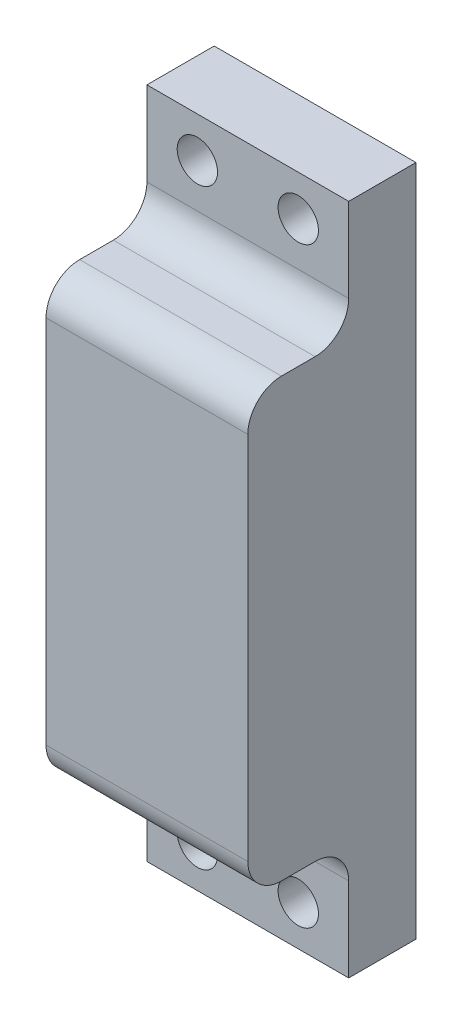
ISO-10303-21;
HEADER;
FILE_DESCRIPTION(('STEP AP214'),'2;1');
FILE_NAME('part.step','',(''),(''),'','','');
FILE_SCHEMA(('AUTOMOTIVE_DESIGN { 1 0 10303 214 1 1 1 1 }'));
ENDSEC;
DATA;
#1=APPLICATION_CONTEXT('core data for automotive mechanical design processes');
#2=APPLICATION_PROTOCOL_DEFINITION('international standard','automotive_design',2000,#1);
#3=PRODUCT_CONTEXT('',#1,'mechanical');
#4=PRODUCT('Part','Part','',(#3));
#5=PRODUCT_RELATED_PRODUCT_CATEGORY('part','',(#4));
#6=PRODUCT_DEFINITION_FORMATION('','',#4);
#7=PRODUCT_DEFINITION_CONTEXT('part definition',#1,'design');
#8=PRODUCT_DEFINITION('design','',#6,#7);
#9=PRODUCT_DEFINITION_SHAPE('','',#8);
#10=(LENGTH_UNIT() NAMED_UNIT(*) SI_UNIT(.MILLI.,.METRE.));
#11=(NAMED_UNIT(*) PLANE_ANGLE_UNIT() SI_UNIT($,.RADIAN.));
#12=(NAMED_UNIT(*) SI_UNIT($,.STERADIAN.) SOLID_ANGLE_UNIT());
#13=UNCERTAINTY_MEASURE_WITH_UNIT(LENGTH_MEASURE(1.E-05),#10,'distance_accuracy_value','');
#14=(GEOMETRIC_REPRESENTATION_CONTEXT(3) GLOBAL_UNCERTAINTY_ASSIGNED_CONTEXT((#13)) GLOBAL_UNIT_ASSIGNED_CONTEXT((#10,
#11,#12)) REPRESENTATION_CONTEXT('',''));
#15=CARTESIAN_POINT('',(0.,0.,0.));
#16=DIRECTION('',(0.,0.,1.));
#17=DIRECTION('',(1.,0.,0.));
#18=AXIS2_PLACEMENT_3D('',#15,#16,#17);
#19=CARTESIAN_POINT('',(-60.,-100.,20.));
#20=DIRECTION('',(0.,-1.,0.));
#21=DIRECTION('',(0.,0.,-1.));
#22=AXIS2_PLACEMENT_3D('',#19,#20,#21);
#23=PLANE('',#22);
#24=DIRECTION('',(0.,0.,-1.));
#25=VECTOR('',#24,1.);
#26=CARTESIAN_POINT('',(0.,-100.,20.));
#27=LINE('',#26,#25);
#28=CARTESIAN_POINT('',(0.,-100.,20.));
#29=VERTEX_POINT('',#28);
#30=CARTESIAN_POINT('',(0.,-100.,0.));
#31=VERTEX_POINT('',#30);
#32=EDGE_CURVE('E172',#29,#31,#27,.T.);
#33=ORIENTED_EDGE('',*,*,#32,.F.);
#34=DIRECTION('',(1.,0.,0.));
#35=VECTOR('',#34,1.);
#36=CARTESIAN_POINT('',(-60.,-100.,20.));
#37=LINE('',#36,#35);
#38=CARTESIAN_POINT('',(-60.,-100.,20.));
#39=VERTEX_POINT('',#38);
#40=EDGE_CURVE('E11',#39,#29,#37,.T.);
#41=ORIENTED_EDGE('',*,*,#40,.F.);
#42=DIRECTION('',(0.,0.,-1.));
#43=VECTOR('',#42,1.);
#44=CARTESIAN_POINT('',(-60.,-100.,20.));
#45=LINE('',#44,#43);
#46=CARTESIAN_POINT('',(-60.,-100.,0.));
#47=VERTEX_POINT('',#46);
#48=EDGE_CURVE('E217',#39,#47,#45,.T.);
#49=ORIENTED_EDGE('',*,*,#48,.T.);
#50=DIRECTION('',(1.,0.,0.));
#51=VECTOR('',#50,1.);
#52=CARTESIAN_POINT('',(-60.,-100.,0.));
#53=LINE('',#52,#51);
#54=EDGE_CURVE('E48',#47,#31,#53,.T.);
#55=ORIENTED_EDGE('',*,*,#54,.T.);
#56=EDGE_LOOP('',(#33,#41,#49,#55));
#57=FACE_BOUND('',#56,.T.);
#58=ADVANCED_FACE('F45',(#57),#23,.T.);
#59=CARTESIAN_POINT('',(-60.,-75.,20.));
#60=DIRECTION('',(0.,0.,1.));
#61=DIRECTION('',(1.,0.,0.));
#62=AXIS2_PLACEMENT_3D('',#59,#60,#61);
#63=PLANE('',#62);
#64=CARTESIAN_POINT('',(-15.,-88.,20.));
#65=DIRECTION('',(0.,0.,1.));
#66=DIRECTION('',(1.,0.,0.));
#67=AXIS2_PLACEMENT_3D('',#64,#65,#66);
#68=CIRCLE('',#67,6.);
#69=CARTESIAN_POINT('',(-9.,-88.,20.));
#70=VERTEX_POINT('',#69);
#71=EDGE_CURVE('E405',#70,#70,#68,.T.);
#72=ORIENTED_EDGE('',*,*,#71,.F.);
#73=EDGE_LOOP('',(#72));
#74=FACE_BOUND('',#73,.T.);
#75=CARTESIAN_POINT('',(-45.,-88.,20.));
#76=DIRECTION('',(0.,0.,1.));
#77=DIRECTION('',(1.,0.,0.));
#78=AXIS2_PLACEMENT_3D('',#75,#76,#77);
#79=CIRCLE('',#78,6.);
#80=CARTESIAN_POINT('',(-39.,-88.,20.));
#81=VERTEX_POINT('',#80);
#82=EDGE_CURVE('E391',#81,#81,#79,.T.);
#83=ORIENTED_EDGE('',*,*,#82,.F.);
#84=EDGE_LOOP('',(#83));
#85=FACE_BOUND('',#84,.T.);
#86=DIRECTION('',(0.,-1.,0.));
#87=VECTOR('',#86,1.);
#88=CARTESIAN_POINT('',(0.,-75.,20.));
#89=LINE('',#88,#87);
#90=CARTESIAN_POINT('',(0.,-75.,20.));
#91=VERTEX_POINT('',#90);
#92=EDGE_CURVE('E214',#91,#29,#89,.T.);
#93=ORIENTED_EDGE('',*,*,#92,.F.);
#94=DIRECTION('',(1.,0.,0.));
#95=VECTOR('',#94,1.);
#96=CARTESIAN_POINT('',(-60.,-75.,20.));
#97=LINE('',#96,#95);
#98=CARTESIAN_POINT('',(-60.,-75.,20.));
#99=VERTEX_POINT('',#98);
#100=EDGE_CURVE('E55',#99,#91,#97,.T.);
#101=ORIENTED_EDGE('',*,*,#100,.F.);
#102=DIRECTION('',(0.,-1.,0.));
#103=VECTOR('',#102,1.);
#104=CARTESIAN_POINT('',(-60.,-75.,20.));
#105=LINE('',#104,#103);
#106=EDGE_CURVE('E158',#99,#39,#105,.T.);
#107=ORIENTED_EDGE('',*,*,#106,.T.);
#108=ORIENTED_EDGE('',*,*,#40,.T.);
#109=EDGE_LOOP('',(#93,#101,#107,#108));
#110=FACE_BOUND('',#109,.T.);
#111=ADVANCED_FACE('F247',(#74,#85,#110),#63,.T.);
#112=CARTESIAN_POINT('',(-60.,-75.,30.));
#113=DIRECTION('',(1.,0.,0.));
#114=DIRECTION('',(0.,0.,-1.));
#115=AXIS2_PLACEMENT_3D('',#112,#113,#114);
#116=CYLINDRICAL_SURFACE('',#115,9.99999999999999);
#117=CARTESIAN_POINT('',(0.,-75.,30.));
#118=DIRECTION('',(-1.,0.,0.));
#119=DIRECTION('',(0.,0.,1.));
#120=AXIS2_PLACEMENT_3D('',#117,#118,#119);
#121=CIRCLE('',#120,9.99999999999999);
#122=CARTESIAN_POINT('',(0.,-65.,30.));
#123=VERTEX_POINT('',#122);
#124=EDGE_CURVE('E144',#123,#91,#121,.T.);
#125=ORIENTED_EDGE('',*,*,#124,.F.);
#126=DIRECTION('',(1.,0.,0.));
#127=VECTOR('',#126,1.);
#128=CARTESIAN_POINT('',(-60.,-65.,30.));
#129=LINE('',#128,#127);
#130=CARTESIAN_POINT('',(-60.,-65.,30.));
#131=VERTEX_POINT('',#130);
#132=EDGE_CURVE('E139',#131,#123,#129,.T.);
#133=ORIENTED_EDGE('',*,*,#132,.F.);
#134=CARTESIAN_POINT('',(-60.,-75.,30.));
#135=DIRECTION('',(-1.,0.,0.));
#136=DIRECTION('',(0.,0.,1.));
#137=AXIS2_PLACEMENT_3D('',#134,#135,#136);
#138=CIRCLE('',#137,9.99999999999999);
#139=EDGE_CURVE('E142',#131,#99,#138,.T.);
#140=ORIENTED_EDGE('',*,*,#139,.T.);
#141=ORIENTED_EDGE('',*,*,#100,.T.);
#142=EDGE_LOOP('',(#125,#133,#140,#141));
#143=FACE_BOUND('',#142,.T.);
#144=ADVANCED_FACE('F141',(#143),#116,.F.);
#145=CARTESIAN_POINT('',(-60.,-65.,39.9999999999999));
#146=DIRECTION('',(0.,-1.,0.));
#147=DIRECTION('',(0.,0.,-1.));
#148=AXIS2_PLACEMENT_3D('',#145,#146,#147);
#149=PLANE('',#148);
#150=DIRECTION('',(0.,0.,-1.));
#151=VECTOR('',#150,1.);
#152=CARTESIAN_POINT('',(0.,-65.,39.9999999999999));
#153=LINE('',#152,#151);
#154=CARTESIAN_POINT('',(0.,-65.,39.9999999999999));
#155=VERTEX_POINT('',#154);
#156=EDGE_CURVE('E209',#155,#123,#153,.T.);
#157=ORIENTED_EDGE('',*,*,#156,.F.);
#158=DIRECTION('',(1.,0.,0.));
#159=VECTOR('',#158,1.);
#160=CARTESIAN_POINT('',(-60.,-65.,39.9999999999999));
#161=LINE('',#160,#159);
#162=CARTESIAN_POINT('',(-60.,-65.,39.9999999999999));
#163=VERTEX_POINT('',#162);
#164=EDGE_CURVE('E150',#163,#155,#161,.T.);
#165=ORIENTED_EDGE('',*,*,#164,.F.);
#166=DIRECTION('',(0.,0.,-1.));
#167=VECTOR('',#166,1.);
#168=CARTESIAN_POINT('',(-60.,-65.,39.9999999999999));
#169=LINE('',#168,#167);
#170=EDGE_CURVE('E156',#163,#131,#169,.T.);
#171=ORIENTED_EDGE('',*,*,#170,.T.);
#172=ORIENTED_EDGE('',*,*,#132,.T.);
#173=EDGE_LOOP('',(#157,#165,#171,#172));
#174=FACE_BOUND('',#173,.T.);
#175=ADVANCED_FACE('F161',(#174),#149,.T.);
#176=CARTESIAN_POINT('',(-60.,-55.,40.));
#177=DIRECTION('',(1.,0.,0.));
#178=DIRECTION('',(0.,0.,-1.));
#179=AXIS2_PLACEMENT_3D('',#176,#177,#178);
#180=CYLINDRICAL_SURFACE('',#179,10.);
#181=CARTESIAN_POINT('',(0.,-55.,40.));
#182=DIRECTION('',(1.,0.,0.));
#183=DIRECTION('',(0.,0.,-1.));
#184=AXIS2_PLACEMENT_3D('',#181,#182,#183);
#185=CIRCLE('',#184,10.);
#186=CARTESIAN_POINT('',(0.,-55.,50.));
#187=VERTEX_POINT('',#186);
#188=EDGE_CURVE('E205',#187,#155,#185,.T.);
#189=ORIENTED_EDGE('',*,*,#188,.F.);
#190=DIRECTION('',(1.,0.,0.));
#191=VECTOR('',#190,1.);
#192=CARTESIAN_POINT('',(-60.,-55.,50.));
#193=LINE('',#192,#191);
#194=CARTESIAN_POINT('',(-60.,-55.,50.));
#195=VERTEX_POINT('',#194);
#196=EDGE_CURVE('E223',#195,#187,#193,.T.);
#197=ORIENTED_EDGE('',*,*,#196,.F.);
#198=CARTESIAN_POINT('',(-60.,-55.,40.));
#199=DIRECTION('',(1.,0.,0.));
#200=DIRECTION('',(0.,0.,-1.));
#201=AXIS2_PLACEMENT_3D('',#198,#199,#200);
#202=CIRCLE('',#201,10.);
#203=EDGE_CURVE('E163',#195,#163,#202,.T.);
#204=ORIENTED_EDGE('',*,*,#203,.T.);
#205=ORIENTED_EDGE('',*,*,#164,.T.);
#206=EDGE_LOOP('',(#189,#197,#204,#205));
#207=FACE_BOUND('',#206,.T.);
#208=ADVANCED_FACE('F265',(#207),#180,.T.);
#209=CARTESIAN_POINT('',(-60.,54.9999999999999,50.));
#210=DIRECTION('',(0.,0.,1.));
#211=DIRECTION('',(0.,-1.,0.));
#212=AXIS2_PLACEMENT_3D('',#209,#210,#211);
#213=PLANE('',#212);
#214=DIRECTION('',(0.,-1.,0.));
#215=VECTOR('',#214,1.);
#216=CARTESIAN_POINT('',(0.,54.9999999999999,50.));
#217=LINE('',#216,#215);
#218=CARTESIAN_POINT('',(0.,54.9999999999999,50.));
#219=VERTEX_POINT('',#218);
#220=EDGE_CURVE('E201',#219,#187,#217,.T.);
#221=ORIENTED_EDGE('',*,*,#220,.F.);
#222=DIRECTION('',(1.,0.,0.));
#223=VECTOR('',#222,1.);
#224=CARTESIAN_POINT('',(-60.,54.9999999999999,50.));
#225=LINE('',#224,#223);
#226=CARTESIAN_POINT('',(-60.,54.9999999999999,50.));
#227=VERTEX_POINT('',#226);
#228=EDGE_CURVE('E226',#227,#219,#225,.T.);
#229=ORIENTED_EDGE('',*,*,#228,.F.);
#230=DIRECTION('',(0.,-1.,0.));
#231=VECTOR('',#230,1.);
#232=CARTESIAN_POINT('',(-60.,54.9999999999999,50.));
#233=LINE('',#232,#231);
#234=EDGE_CURVE('E166',#227,#195,#233,.T.);
#235=ORIENTED_EDGE('',*,*,#234,.T.);
#236=ORIENTED_EDGE('',*,*,#196,.T.);
#237=EDGE_LOOP('',(#221,#229,#235,#236));
#238=FACE_BOUND('',#237,.T.);
#239=ADVANCED_FACE('F268',(#238),#213,.T.);
#240=CARTESIAN_POINT('',(-60.,55.,40.));
#241=DIRECTION('',(1.,0.,0.));
#242=DIRECTION('',(0.,0.,-1.));
#243=AXIS2_PLACEMENT_3D('',#240,#241,#242);
#244=CYLINDRICAL_SURFACE('',#243,10.);
#245=CARTESIAN_POINT('',(0.,55.,40.));
#246=DIRECTION('',(1.,0.,0.));
#247=DIRECTION('',(0.,0.,-1.));
#248=AXIS2_PLACEMENT_3D('',#245,#246,#247);
#249=CIRCLE('',#248,10.);
#250=CARTESIAN_POINT('',(0.,65.,39.9999999999999));
#251=VERTEX_POINT('',#250);
#252=EDGE_CURVE('E197',#251,#219,#249,.T.);
#253=ORIENTED_EDGE('',*,*,#252,.F.);
#254=DIRECTION('',(1.,0.,0.));
#255=VECTOR('',#254,1.);
#256=CARTESIAN_POINT('',(-60.,65.,39.9999999999999));
#257=LINE('',#256,#255);
#258=CARTESIAN_POINT('',(-60.,65.,39.9999999999999));
#259=VERTEX_POINT('',#258);
#260=EDGE_CURVE('E229',#259,#251,#257,.T.);
#261=ORIENTED_EDGE('',*,*,#260,.F.);
#262=CARTESIAN_POINT('',(-60.,55.,40.));
#263=DIRECTION('',(1.,0.,0.));
#264=DIRECTION('',(0.,0.,-1.));
#265=AXIS2_PLACEMENT_3D('',#262,#263,#264);
#266=CIRCLE('',#265,10.);
#267=EDGE_CURVE('E342',#259,#227,#266,.T.);
#268=ORIENTED_EDGE('',*,*,#267,.T.);
#269=ORIENTED_EDGE('',*,*,#228,.T.);
#270=EDGE_LOOP('',(#253,#261,#268,#269));
#271=FACE_BOUND('',#270,.T.);
#272=ADVANCED_FACE('F272',(#271),#244,.T.);
#273=CARTESIAN_POINT('',(-60.,65.,30.));
#274=DIRECTION('',(0.,1.,0.));
#275=DIRECTION('',(0.,0.,1.));
#276=AXIS2_PLACEMENT_3D('',#273,#274,#275);
#277=PLANE('',#276);
#278=DIRECTION('',(0.,0.,1.));
#279=VECTOR('',#278,1.);
#280=CARTESIAN_POINT('',(0.,65.,30.));
#281=LINE('',#280,#279);
#282=CARTESIAN_POINT('',(0.,65.,30.));
#283=VERTEX_POINT('',#282);
#284=EDGE_CURVE('E193',#283,#251,#281,.T.);
#285=ORIENTED_EDGE('',*,*,#284,.F.);
#286=DIRECTION('',(1.,0.,0.));
#287=VECTOR('',#286,1.);
#288=CARTESIAN_POINT('',(-60.,65.,30.));
#289=LINE('',#288,#287);
#290=CARTESIAN_POINT('',(-60.,65.,30.));
#291=VERTEX_POINT('',#290);
#292=EDGE_CURVE('E232',#291,#283,#289,.T.);
#293=ORIENTED_EDGE('',*,*,#292,.F.);
#294=DIRECTION('',(0.,0.,1.));
#295=VECTOR('',#294,1.);
#296=CARTESIAN_POINT('',(-60.,65.,30.));
#297=LINE('',#296,#295);
#298=EDGE_CURVE('E338',#291,#259,#297,.T.);
#299=ORIENTED_EDGE('',*,*,#298,.T.);
#300=ORIENTED_EDGE('',*,*,#260,.T.);
#301=EDGE_LOOP('',(#285,#293,#299,#300));
#302=FACE_BOUND('',#301,.T.);
#303=ADVANCED_FACE('F276',(#302),#277,.T.);
#304=CARTESIAN_POINT('',(-60.,75.,30.));
#305=DIRECTION('',(1.,0.,0.));
#306=DIRECTION('',(0.,0.,-1.));
#307=AXIS2_PLACEMENT_3D('',#304,#305,#306);
#308=CYLINDRICAL_SURFACE('',#307,10.);
#309=CARTESIAN_POINT('',(0.,75.,30.));
#310=DIRECTION('',(-1.,0.,0.));
#311=DIRECTION('',(0.,0.,1.));
#312=AXIS2_PLACEMENT_3D('',#309,#310,#311);
#313=CIRCLE('',#312,10.);
#314=CARTESIAN_POINT('',(0.,75.,20.));
#315=VERTEX_POINT('',#314);
#316=EDGE_CURVE('E189',#315,#283,#313,.T.);
#317=ORIENTED_EDGE('',*,*,#316,.F.);
#318=DIRECTION('',(1.,0.,0.));
#319=VECTOR('',#318,1.);
#320=CARTESIAN_POINT('',(-60.,75.,20.));
#321=LINE('',#320,#319);
#322=CARTESIAN_POINT('',(-60.,75.,20.));
#323=VERTEX_POINT('',#322);
#324=EDGE_CURVE('E235',#323,#315,#321,.T.);
#325=ORIENTED_EDGE('',*,*,#324,.F.);
#326=CARTESIAN_POINT('',(-60.,75.,30.));
#327=DIRECTION('',(-1.,0.,0.));
#328=DIRECTION('',(0.,0.,1.));
#329=AXIS2_PLACEMENT_3D('',#326,#327,#328);
#330=CIRCLE('',#329,10.);
#331=EDGE_CURVE('E334',#323,#291,#330,.T.);
#332=ORIENTED_EDGE('',*,*,#331,.T.);
#333=ORIENTED_EDGE('',*,*,#292,.T.);
#334=EDGE_LOOP('',(#317,#325,#332,#333));
#335=FACE_BOUND('',#334,.T.);
#336=ADVANCED_FACE('F280',(#335),#308,.F.);
#337=CARTESIAN_POINT('',(-60.,100.,20.));
#338=DIRECTION('',(0.,0.,1.));
#339=DIRECTION('',(0.,-1.,0.));
#340=AXIS2_PLACEMENT_3D('',#337,#338,#339);
#341=PLANE('',#340);
#342=CARTESIAN_POINT('',(-45.,88.,20.));
#343=DIRECTION('',(0.,0.,1.));
#344=DIRECTION('',(1.,0.,0.));
#345=AXIS2_PLACEMENT_3D('',#342,#343,#344);
#346=CIRCLE('',#345,6.);
#347=CARTESIAN_POINT('',(-39.,88.,20.));
#348=VERTEX_POINT('',#347);
#349=EDGE_CURVE('E377',#348,#348,#346,.T.);
#350=ORIENTED_EDGE('',*,*,#349,.F.);
#351=EDGE_LOOP('',(#350));
#352=FACE_BOUND('',#351,.T.);
#353=CARTESIAN_POINT('',(-15.,88.,20.));
#354=DIRECTION('',(0.,0.,1.));
#355=DIRECTION('',(1.,0.,0.));
#356=AXIS2_PLACEMENT_3D('',#353,#354,#355);
#357=CIRCLE('',#356,6.);
#358=CARTESIAN_POINT('',(-9.,88.,20.));
#359=VERTEX_POINT('',#358);
#360=EDGE_CURVE('E363',#359,#359,#357,.T.);
#361=ORIENTED_EDGE('',*,*,#360,.F.);
#362=EDGE_LOOP('',(#361));
#363=FACE_BOUND('',#362,.T.);
#364=DIRECTION('',(0.,-1.,0.));
#365=VECTOR('',#364,1.);
#366=CARTESIAN_POINT('',(0.,100.,20.));
#367=LINE('',#366,#365);
#368=CARTESIAN_POINT('',(0.,100.,20.));
#369=VERTEX_POINT('',#368);
#370=EDGE_CURVE('E185',#369,#315,#367,.T.);
#371=ORIENTED_EDGE('',*,*,#370,.F.);
#372=DIRECTION('',(1.,0.,0.));
#373=VECTOR('',#372,1.);
#374=CARTESIAN_POINT('',(-60.,100.,20.));
#375=LINE('',#374,#373);
#376=CARTESIAN_POINT('',(-60.,100.,20.));
#377=VERTEX_POINT('',#376);
#378=EDGE_CURVE('E238',#377,#369,#375,.T.);
#379=ORIENTED_EDGE('',*,*,#378,.F.);
#380=DIRECTION('',(0.,-1.,0.));
#381=VECTOR('',#380,1.);
#382=CARTESIAN_POINT('',(-60.,100.,20.));
#383=LINE('',#382,#381);
#384=EDGE_CURVE('E330',#377,#323,#383,.T.);
#385=ORIENTED_EDGE('',*,*,#384,.T.);
#386=ORIENTED_EDGE('',*,*,#324,.T.);
#387=EDGE_LOOP('',(#371,#379,#385,#386));
#388=FACE_BOUND('',#387,.T.);
#389=ADVANCED_FACE('F284',(#352,#363,#388),#341,.T.);
#390=CARTESIAN_POINT('',(-60.,100.,0.));
#391=DIRECTION('',(0.,1.,0.));
#392=DIRECTION('',(0.,0.,1.));
#393=AXIS2_PLACEMENT_3D('',#390,#391,#392);
#394=PLANE('',#393);
#395=DIRECTION('',(0.,0.,1.));
#396=VECTOR('',#395,1.);
#397=CARTESIAN_POINT('',(0.,100.,0.));
#398=LINE('',#397,#396);
#399=CARTESIAN_POINT('',(0.,100.,0.));
#400=VERTEX_POINT('',#399);
#401=EDGE_CURVE('E181',#400,#369,#398,.T.);
#402=ORIENTED_EDGE('',*,*,#401,.F.);
#403=DIRECTION('',(1.,0.,0.));
#404=VECTOR('',#403,1.);
#405=CARTESIAN_POINT('',(-60.,100.,0.));
#406=LINE('',#405,#404);
#407=CARTESIAN_POINT('',(-60.,100.,0.));
#408=VERTEX_POINT('',#407);
#409=EDGE_CURVE('E240',#408,#400,#406,.T.);
#410=ORIENTED_EDGE('',*,*,#409,.F.);
#411=DIRECTION('',(0.,0.,1.));
#412=VECTOR('',#411,1.);
#413=CARTESIAN_POINT('',(-60.,100.,0.));
#414=LINE('',#413,#412);
#415=EDGE_CURVE('E326',#408,#377,#414,.T.);
#416=ORIENTED_EDGE('',*,*,#415,.T.);
#417=ORIENTED_EDGE('',*,*,#378,.T.);
#418=EDGE_LOOP('',(#402,#410,#416,#417));
#419=FACE_BOUND('',#418,.T.);
#420=ADVANCED_FACE('F287',(#419),#394,.T.);
#421=CARTESIAN_POINT('',(-60.,-100.,0.));
#422=DIRECTION('',(0.,0.,-1.));
#423=DIRECTION('',(0.,1.,0.));
#424=AXIS2_PLACEMENT_3D('',#421,#422,#423);
#425=PLANE('',#424);
#426=CARTESIAN_POINT('',(-15.,-88.,0.));
#427=DIRECTION('',(0.,0.,1.));
#428=DIRECTION('',(1.,0.,0.));
#429=AXIS2_PLACEMENT_3D('',#426,#427,#428);
#430=CIRCLE('',#429,4.);
#431=CARTESIAN_POINT('',(-11.,-88.,0.));
#432=VERTEX_POINT('',#431);
#433=EDGE_CURVE('E300',#432,#432,#430,.T.);
#434=ORIENTED_EDGE('',*,*,#433,.T.);
#435=EDGE_LOOP('',(#434));
#436=FACE_BOUND('',#435,.T.);
#437=CARTESIAN_POINT('',(-45.,-88.,0.));
#438=DIRECTION('',(0.,0.,1.));
#439=DIRECTION('',(1.,0.,0.));
#440=AXIS2_PLACEMENT_3D('',#437,#438,#439);
#441=CIRCLE('',#440,4.);
#442=CARTESIAN_POINT('',(-41.,-88.,0.));
#443=VERTEX_POINT('',#442);
#444=EDGE_CURVE('E304',#443,#443,#441,.T.);
#445=ORIENTED_EDGE('',*,*,#444,.T.);
#446=EDGE_LOOP('',(#445));
#447=FACE_BOUND('',#446,.T.);
#448=CARTESIAN_POINT('',(-45.,88.,0.));
#449=DIRECTION('',(0.,0.,1.));
#450=DIRECTION('',(1.,0.,0.));
#451=AXIS2_PLACEMENT_3D('',#448,#449,#450);
#452=CIRCLE('',#451,4.);
#453=CARTESIAN_POINT('',(-41.,88.,0.));
#454=VERTEX_POINT('',#453);
#455=EDGE_CURVE('E308',#454,#454,#452,.T.);
#456=ORIENTED_EDGE('',*,*,#455,.T.);
#457=EDGE_LOOP('',(#456));
#458=FACE_BOUND('',#457,.T.);
#459=CARTESIAN_POINT('',(-15.,88.,0.));
#460=DIRECTION('',(0.,0.,1.));
#461=DIRECTION('',(1.,0.,0.));
#462=AXIS2_PLACEMENT_3D('',#459,#460,#461);
#463=CIRCLE('',#462,4.);
#464=CARTESIAN_POINT('',(-11.,88.,0.));
#465=VERTEX_POINT('',#464);
#466=EDGE_CURVE('E177',#465,#465,#463,.T.);
#467=ORIENTED_EDGE('',*,*,#466,.T.);
#468=EDGE_LOOP('',(#467));
#469=FACE_BOUND('',#468,.T.);
#470=DIRECTION('',(0.,1.,0.));
#471=VECTOR('',#470,1.);
#472=CARTESIAN_POINT('',(0.,-100.,0.));
#473=LINE('',#472,#471);
#474=EDGE_CURVE('E176',#31,#400,#473,.T.);
#475=ORIENTED_EDGE('',*,*,#474,.F.);
#476=ORIENTED_EDGE('',*,*,#54,.F.);
#477=DIRECTION('',(0.,1.,0.));
#478=VECTOR('',#477,1.);
#479=CARTESIAN_POINT('',(-60.,-100.,0.));
#480=LINE('',#479,#478);
#481=EDGE_CURVE('E323',#47,#408,#480,.T.);
#482=ORIENTED_EDGE('',*,*,#481,.T.);
#483=ORIENTED_EDGE('',*,*,#409,.T.);
#484=EDGE_LOOP('',(#475,#476,#482,#483));
#485=FACE_BOUND('',#484,.T.);
#486=ADVANCED_FACE('F244',(#436,#447,#458,#469,#485),#425,.T.);
#487=CARTESIAN_POINT('',(-60.,75.,30.));
#488=DIRECTION('',(-1.,0.,0.));
#489=DIRECTION('',(0.,0.,1.));
#490=AXIS2_PLACEMENT_3D('',#487,#488,#489);
#491=PLANE('',#490);
#492=ORIENTED_EDGE('',*,*,#48,.F.);
#493=ORIENTED_EDGE('',*,*,#106,.F.);
#494=ORIENTED_EDGE('',*,*,#139,.F.);
#495=ORIENTED_EDGE('',*,*,#170,.F.);
#496=ORIENTED_EDGE('',*,*,#203,.F.);
#497=ORIENTED_EDGE('',*,*,#234,.F.);
#498=ORIENTED_EDGE('',*,*,#267,.F.);
#499=ORIENTED_EDGE('',*,*,#298,.F.);
#500=ORIENTED_EDGE('',*,*,#331,.F.);
#501=ORIENTED_EDGE('',*,*,#384,.F.);
#502=ORIENTED_EDGE('',*,*,#415,.F.);
#503=ORIENTED_EDGE('',*,*,#481,.F.);
#504=EDGE_LOOP('',(#492,#493,#494,#495,#496,#497,#498,#499,#500,#501,#502,#503));
#505=FACE_BOUND('',#504,.T.);
#506=ADVANCED_FACE('F154',(#505),#491,.T.);
#507=CARTESIAN_POINT('',(0.,75.,30.));
#508=DIRECTION('',(-1.,0.,0.));
#509=DIRECTION('',(0.,0.,1.));
#510=AXIS2_PLACEMENT_3D('',#507,#508,#509);
#511=PLANE('',#510);
#512=ORIENTED_EDGE('',*,*,#32,.T.);
#513=ORIENTED_EDGE('',*,*,#474,.T.);
#514=ORIENTED_EDGE('',*,*,#401,.T.);
#515=ORIENTED_EDGE('',*,*,#370,.T.);
#516=ORIENTED_EDGE('',*,*,#316,.T.);
#517=ORIENTED_EDGE('',*,*,#284,.T.);
#518=ORIENTED_EDGE('',*,*,#252,.T.);
#519=ORIENTED_EDGE('',*,*,#220,.T.);
#520=ORIENTED_EDGE('',*,*,#188,.T.);
#521=ORIENTED_EDGE('',*,*,#156,.T.);
#522=ORIENTED_EDGE('',*,*,#124,.T.);
#523=ORIENTED_EDGE('',*,*,#92,.T.);
#524=EDGE_LOOP('',(#512,#513,#514,#515,#516,#517,#518,#519,#520,#521,#522,#523));
#525=FACE_BOUND('',#524,.T.);
#526=ADVANCED_FACE('F246',(#525),#511,.F.);
#527=CARTESIAN_POINT('',(-15.,88.,20.));
#528=DIRECTION('',(0.,0.,1.));
#529=DIRECTION('',(1.,0.,0.));
#530=AXIS2_PLACEMENT_3D('',#527,#528,#529);
#531=CYLINDRICAL_SURFACE('',#530,4.);
#532=ORIENTED_EDGE('',*,*,#466,.F.);
#533=EDGE_LOOP('',(#532));
#534=FACE_BOUND('',#533,.T.);
#535=CARTESIAN_POINT('',(-15.,88.,10.));
#536=DIRECTION('',(0.,0.,1.));
#537=DIRECTION('',(1.,0.,0.));
#538=AXIS2_PLACEMENT_3D('',#535,#536,#537);
#539=CIRCLE('',#538,4.);
#540=CARTESIAN_POINT('',(-11.,88.,10.));
#541=VERTEX_POINT('',#540);
#542=EDGE_CURVE('E313',#541,#541,#539,.T.);
#543=ORIENTED_EDGE('',*,*,#542,.T.);
#544=EDGE_LOOP('',(#543));
#545=FACE_BOUND('',#544,.T.);
#546=ADVANCED_FACE('F456',(#534,#545),#531,.F.);
#547=CARTESIAN_POINT('',(-11.,88.,10.));
#548=DIRECTION('',(0.,0.,-1.));
#549=DIRECTION('',(-1.,0.,0.));
#550=AXIS2_PLACEMENT_3D('',#547,#548,#549);
#551=PLANE('',#550);
#552=ORIENTED_EDGE('',*,*,#542,.F.);
#553=EDGE_LOOP('',(#552));
#554=FACE_BOUND('',#553,.T.);
#555=CARTESIAN_POINT('',(-15.,88.,10.));
#556=DIRECTION('',(0.,0.,1.));
#557=DIRECTION('',(1.,0.,0.));
#558=AXIS2_PLACEMENT_3D('',#555,#556,#557);
#559=CIRCLE('',#558,6.);
#560=CARTESIAN_POINT('',(-9.,88.,10.));
#561=VERTEX_POINT('',#560);
#562=EDGE_CURVE('E317',#561,#561,#559,.T.);
#563=ORIENTED_EDGE('',*,*,#562,.T.);
#564=EDGE_LOOP('',(#563));
#565=FACE_BOUND('',#564,.T.);
#566=ADVANCED_FACE('F452',(#554,#565),#551,.F.);
#567=CARTESIAN_POINT('',(-15.,88.,20.));
#568=DIRECTION('',(0.,0.,1.));
#569=DIRECTION('',(1.,0.,0.));
#570=AXIS2_PLACEMENT_3D('',#567,#568,#569);
#571=CYLINDRICAL_SURFACE('',#570,6.);
#572=ORIENTED_EDGE('',*,*,#562,.F.);
#573=EDGE_LOOP('',(#572));
#574=FACE_BOUND('',#573,.T.);
#575=ORIENTED_EDGE('',*,*,#360,.T.);
#576=EDGE_LOOP('',(#575));
#577=FACE_BOUND('',#576,.T.);
#578=ADVANCED_FACE('F448',(#574,#577),#571,.F.);
#579=CARTESIAN_POINT('',(-45.,88.,20.));
#580=DIRECTION('',(0.,0.,1.));
#581=DIRECTION('',(1.,0.,0.));
#582=AXIS2_PLACEMENT_3D('',#579,#580,#581);
#583=CYLINDRICAL_SURFACE('',#582,4.);
#584=ORIENTED_EDGE('',*,*,#455,.F.);
#585=EDGE_LOOP('',(#584));
#586=FACE_BOUND('',#585,.T.);
#587=CARTESIAN_POINT('',(-45.,88.,10.));
#588=DIRECTION('',(0.,0.,1.));
#589=DIRECTION('',(1.,0.,0.));
#590=AXIS2_PLACEMENT_3D('',#587,#588,#589);
#591=CIRCLE('',#590,4.);
#592=CARTESIAN_POINT('',(-41.,88.,10.));
#593=VERTEX_POINT('',#592);
#594=EDGE_CURVE('E369',#593,#593,#591,.T.);
#595=ORIENTED_EDGE('',*,*,#594,.T.);
#596=EDGE_LOOP('',(#595));
#597=FACE_BOUND('',#596,.T.);
#598=ADVANCED_FACE('F444',(#586,#597),#583,.F.);
#599=CARTESIAN_POINT('',(-41.,88.,10.));
#600=DIRECTION('',(0.,0.,-1.));
#601=DIRECTION('',(-1.,0.,0.));
#602=AXIS2_PLACEMENT_3D('',#599,#600,#601);
#603=PLANE('',#602);
#604=ORIENTED_EDGE('',*,*,#594,.F.);
#605=EDGE_LOOP('',(#604));
#606=FACE_BOUND('',#605,.T.);
#607=CARTESIAN_POINT('',(-45.,88.,10.));
#608=DIRECTION('',(0.,0.,1.));
#609=DIRECTION('',(1.,0.,0.));
#610=AXIS2_PLACEMENT_3D('',#607,#608,#609);
#611=CIRCLE('',#610,6.);
#612=CARTESIAN_POINT('',(-39.,88.,10.));
#613=VERTEX_POINT('',#612);
#614=EDGE_CURVE('E373',#613,#613,#611,.T.);
#615=ORIENTED_EDGE('',*,*,#614,.T.);
#616=EDGE_LOOP('',(#615));
#617=FACE_BOUND('',#616,.T.);
#618=ADVANCED_FACE('F440',(#606,#617),#603,.F.);
#619=CARTESIAN_POINT('',(-45.,88.,20.));
#620=DIRECTION('',(0.,0.,1.));
#621=DIRECTION('',(1.,0.,0.));
#622=AXIS2_PLACEMENT_3D('',#619,#620,#621);
#623=CYLINDRICAL_SURFACE('',#622,6.);
#624=ORIENTED_EDGE('',*,*,#614,.F.);
#625=EDGE_LOOP('',(#624));
#626=FACE_BOUND('',#625,.T.);
#627=ORIENTED_EDGE('',*,*,#349,.T.);
#628=EDGE_LOOP('',(#627));
#629=FACE_BOUND('',#628,.T.);
#630=ADVANCED_FACE('F436',(#626,#629),#623,.F.);
#631=CARTESIAN_POINT('',(-45.,-88.,20.));
#632=DIRECTION('',(0.,0.,1.));
#633=DIRECTION('',(1.,0.,0.));
#634=AXIS2_PLACEMENT_3D('',#631,#632,#633);
#635=CYLINDRICAL_SURFACE('',#634,4.);
#636=ORIENTED_EDGE('',*,*,#444,.F.);
#637=EDGE_LOOP('',(#636));
#638=FACE_BOUND('',#637,.T.);
#639=CARTESIAN_POINT('',(-45.,-88.,10.));
#640=DIRECTION('',(0.,0.,1.));
#641=DIRECTION('',(1.,0.,0.));
#642=AXIS2_PLACEMENT_3D('',#639,#640,#641);
#643=CIRCLE('',#642,4.);
#644=CARTESIAN_POINT('',(-41.,-88.,10.));
#645=VERTEX_POINT('',#644);
#646=EDGE_CURVE('E383',#645,#645,#643,.T.);
#647=ORIENTED_EDGE('',*,*,#646,.T.);
#648=EDGE_LOOP('',(#647));
#649=FACE_BOUND('',#648,.T.);
#650=ADVANCED_FACE('F432',(#638,#649),#635,.F.);
#651=CARTESIAN_POINT('',(-41.,-88.,10.));
#652=DIRECTION('',(0.,0.,-1.));
#653=DIRECTION('',(-1.,0.,0.));
#654=AXIS2_PLACEMENT_3D('',#651,#652,#653);
#655=PLANE('',#654);
#656=ORIENTED_EDGE('',*,*,#646,.F.);
#657=EDGE_LOOP('',(#656));
#658=FACE_BOUND('',#657,.T.);
#659=CARTESIAN_POINT('',(-45.,-88.,10.));
#660=DIRECTION('',(0.,0.,1.));
#661=DIRECTION('',(1.,0.,0.));
#662=AXIS2_PLACEMENT_3D('',#659,#660,#661);
#663=CIRCLE('',#662,6.);
#664=CARTESIAN_POINT('',(-39.,-88.,10.));
#665=VERTEX_POINT('',#664);
#666=EDGE_CURVE('E387',#665,#665,#663,.T.);
#667=ORIENTED_EDGE('',*,*,#666,.T.);
#668=EDGE_LOOP('',(#667));
#669=FACE_BOUND('',#668,.T.);
#670=ADVANCED_FACE('F428',(#658,#669),#655,.F.);
#671=CARTESIAN_POINT('',(-45.,-88.,20.));
#672=DIRECTION('',(0.,0.,1.));
#673=DIRECTION('',(1.,0.,0.));
#674=AXIS2_PLACEMENT_3D('',#671,#672,#673);
#675=CYLINDRICAL_SURFACE('',#674,6.);
#676=ORIENTED_EDGE('',*,*,#666,.F.);
#677=EDGE_LOOP('',(#676));
#678=FACE_BOUND('',#677,.T.);
#679=ORIENTED_EDGE('',*,*,#82,.T.);
#680=EDGE_LOOP('',(#679));
#681=FACE_BOUND('',#680,.T.);
#682=ADVANCED_FACE('F424',(#678,#681),#675,.F.);
#683=CARTESIAN_POINT('',(-15.,-88.,20.));
#684=DIRECTION('',(0.,0.,1.));
#685=DIRECTION('',(1.,0.,0.));
#686=AXIS2_PLACEMENT_3D('',#683,#684,#685);
#687=CYLINDRICAL_SURFACE('',#686,4.);
#688=ORIENTED_EDGE('',*,*,#433,.F.);
#689=EDGE_LOOP('',(#688));
#690=FACE_BOUND('',#689,.T.);
#691=CARTESIAN_POINT('',(-15.,-88.,10.));
#692=DIRECTION('',(0.,0.,1.));
#693=DIRECTION('',(1.,0.,0.));
#694=AXIS2_PLACEMENT_3D('',#691,#692,#693);
#695=CIRCLE('',#694,4.);
#696=CARTESIAN_POINT('',(-11.,-88.,10.));
#697=VERTEX_POINT('',#696);
#698=EDGE_CURVE('E397',#697,#697,#695,.T.);
#699=ORIENTED_EDGE('',*,*,#698,.T.);
#700=EDGE_LOOP('',(#699));
#701=FACE_BOUND('',#700,.T.);
#702=ADVANCED_FACE('F417',(#690,#701),#687,.F.);
#703=CARTESIAN_POINT('',(-11.,-88.,10.));
#704=DIRECTION('',(0.,0.,-1.));
#705=DIRECTION('',(-1.,0.,0.));
#706=AXIS2_PLACEMENT_3D('',#703,#704,#705);
#707=PLANE('',#706);
#708=ORIENTED_EDGE('',*,*,#698,.F.);
#709=EDGE_LOOP('',(#708));
#710=FACE_BOUND('',#709,.T.);
#711=CARTESIAN_POINT('',(-15.,-88.,10.));
#712=DIRECTION('',(0.,0.,1.));
#713=DIRECTION('',(1.,0.,0.));
#714=AXIS2_PLACEMENT_3D('',#711,#712,#713);
#715=CIRCLE('',#714,6.);
#716=CARTESIAN_POINT('',(-9.,-88.,10.));
#717=VERTEX_POINT('',#716);
#718=EDGE_CURVE('E401',#717,#717,#715,.T.);
#719=ORIENTED_EDGE('',*,*,#718,.T.);
#720=EDGE_LOOP('',(#719));
#721=FACE_BOUND('',#720,.T.);
#722=ADVANCED_FACE('F411',(#710,#721),#707,.F.);
#723=CARTESIAN_POINT('',(-15.,-88.,20.));
#724=DIRECTION('',(0.,0.,1.));
#725=DIRECTION('',(1.,0.,0.));
#726=AXIS2_PLACEMENT_3D('',#723,#724,#725);
#727=CYLINDRICAL_SURFACE('',#726,6.);
#728=ORIENTED_EDGE('',*,*,#718,.F.);
#729=EDGE_LOOP('',(#728));
#730=FACE_BOUND('',#729,.T.);
#731=ORIENTED_EDGE('',*,*,#71,.T.);
#732=EDGE_LOOP('',(#731));
#733=FACE_BOUND('',#732,.T.);
#734=ADVANCED_FACE('F409',(#730,#733),#727,.F.);
#735=CLOSED_SHELL('',(#58,#111,#144,#175,#208,#239,#272,#303,#336,#389,#420,#486,#506,#526,#546,
#566,#578,#598,#618,#630,#650,#670,#682,#702,#722,#734));
#736=MANIFOLD_SOLID_BREP('B2',#735);
#737=ADVANCED_BREP_SHAPE_REPRESENTATION('',(#18,#736),#14);
#738=SHAPE_DEFINITION_REPRESENTATION(#9,#737);
ENDSEC;
END-ISO-10303-21;
